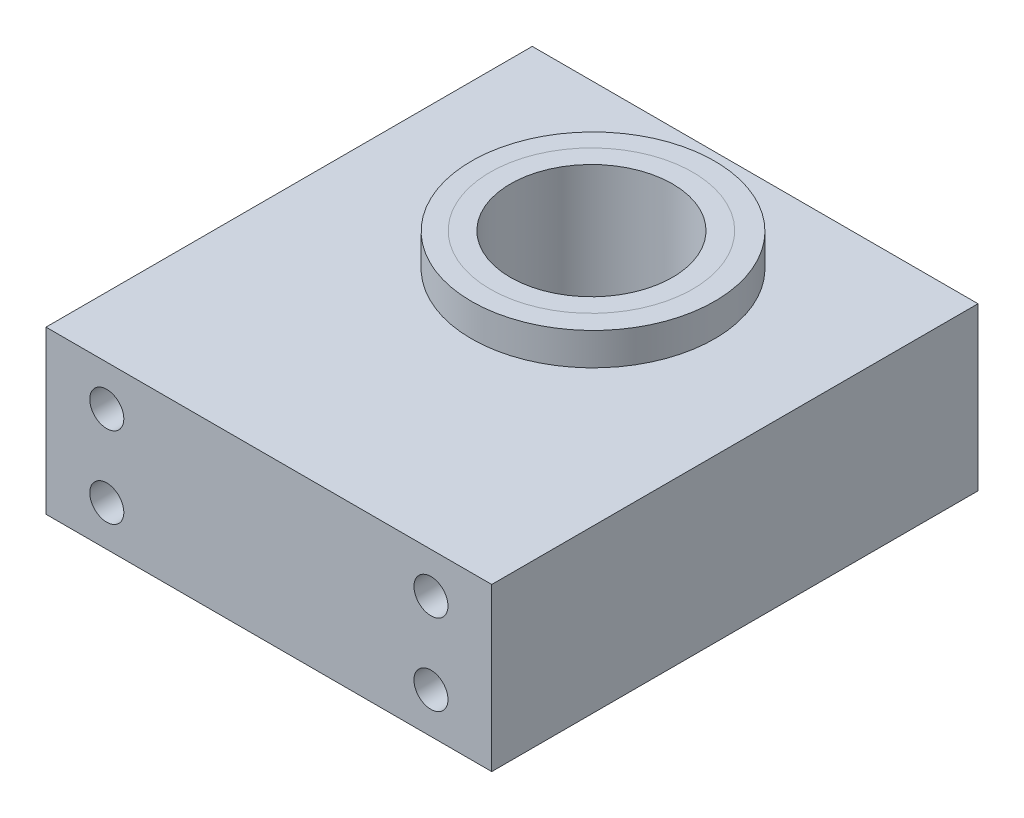
ISO-10303-21;
HEADER;
FILE_DESCRIPTION(('STEP AP214'),'2;1');
FILE_NAME('part.step','',(''),(''),'','','');
FILE_SCHEMA(('AUTOMOTIVE_DESIGN { 1 0 10303 214 1 1 1 1 }'));
ENDSEC;
DATA;
#1=APPLICATION_CONTEXT('core data for automotive mechanical design processes');
#2=APPLICATION_PROTOCOL_DEFINITION('international standard','automotive_design',2000,#1);
#3=PRODUCT_CONTEXT('',#1,'mechanical');
#4=PRODUCT('Part','Part','',(#3));
#5=PRODUCT_RELATED_PRODUCT_CATEGORY('part','',(#4));
#6=PRODUCT_DEFINITION_FORMATION('','',#4);
#7=PRODUCT_DEFINITION_CONTEXT('part definition',#1,'design');
#8=PRODUCT_DEFINITION('design','',#6,#7);
#9=PRODUCT_DEFINITION_SHAPE('','',#8);
#10=(LENGTH_UNIT() NAMED_UNIT(*) SI_UNIT(.MILLI.,.METRE.));
#11=(NAMED_UNIT(*) PLANE_ANGLE_UNIT() SI_UNIT($,.RADIAN.));
#12=(NAMED_UNIT(*) SI_UNIT($,.STERADIAN.) SOLID_ANGLE_UNIT());
#13=UNCERTAINTY_MEASURE_WITH_UNIT(LENGTH_MEASURE(1.E-05),#10,'distance_accuracy_value','');
#14=(GEOMETRIC_REPRESENTATION_CONTEXT(3) GLOBAL_UNCERTAINTY_ASSIGNED_CONTEXT((#13)) GLOBAL_UNIT_ASSIGNED_CONTEXT((#10,
#11,#12)) REPRESENTATION_CONTEXT('',''));
#15=CARTESIAN_POINT('',(0.,0.,0.));
#16=DIRECTION('',(0.,0.,1.));
#17=DIRECTION('',(1.,0.,0.));
#18=AXIS2_PLACEMENT_3D('',#15,#16,#17);
#19=CARTESIAN_POINT('',(-0.316230532057871,118.710678118655,0.0774764803540193));
#20=DIRECTION('',(0.,-1.,0.));
#21=DIRECTION('',(0.,0.,-1.));
#22=AXIS2_PLACEMENT_3D('',#19,#20,#21);
#23=CYLINDRICAL_SURFACE('',#22,25.);
#24=CARTESIAN_POINT('',(-0.316230532057871,22.4799190008132,-24.922523519646));
#25=CARTESIAN_POINT('',(-0.455239837255461,22.4621869101481,-24.9225220265215));
#26=CARTESIAN_POINT('',(-0.592847411947307,22.4327275879034,-24.9213521267131));
#27=CARTESIAN_POINT('',(-0.861256000529966,22.3511603012757,-24.9169434967077));
#28=CARTESIAN_POINT('',(-0.992049250753723,22.2990271098854,-24.9137024602682));
#29=CARTESIAN_POINT('',(-1.24294808501132,22.1736440076452,-24.9056567553287));
#30=CARTESIAN_POINT('',(-1.36306007224317,22.1004068613883,-24.9008530317843));
#31=CARTESIAN_POINT('',(-1.58927576714678,21.9349014404351,-24.8903468224926));
#32=CARTESIAN_POINT('',(-1.695382351723,21.8426370842012,-24.8846445218551));
#33=CARTESIAN_POINT('',(-1.89094367292197,21.6413643228509,-24.8730730731633));
#34=CARTESIAN_POINT('',(-1.98034887253453,21.5323078034375,-24.8672034864657));
#35=CARTESIAN_POINT('',(-2.13960313954408,21.3007109783937,-24.8560693323857));
#36=CARTESIAN_POINT('',(-2.20945150620669,21.1781701898319,-24.8508047866862));
#37=CARTESIAN_POINT('',(-2.32764107148475,20.9229702029001,-24.8415476238178));
#38=CARTESIAN_POINT('',(-2.37596721209624,20.790303996071,-24.8375558977288));
#39=CARTESIAN_POINT('',(-2.4496427703701,20.5186987912336,-24.8313559271911));
#40=CARTESIAN_POINT('',(-2.4749927477621,20.3797599461214,-24.8291476392957));
#41=CARTESIAN_POINT('',(-2.50193308363348,20.1000415548483,-24.8267980654592));
#42=CARTESIAN_POINT('',(-2.50360116407408,19.9592695483122,-24.8266500180168));
#43=CARTESIAN_POINT('',(-2.48332944240001,19.6794506069448,-24.8284220668521));
#44=CARTESIAN_POINT('',(-2.46138989643687,19.5404036534126,-24.8303421406901));
#45=CARTESIAN_POINT('',(-2.39459173371572,19.2681927836016,-24.8360043002316));
#46=CARTESIAN_POINT('',(-2.34976770030956,19.1350203186788,-24.8397436362411));
#47=CARTESIAN_POINT('',(-2.23850404669461,18.8780820051222,-24.8485733786926));
#48=CARTESIAN_POINT('',(-2.1720639619905,18.7543163586968,-24.8536638141671));
#49=CARTESIAN_POINT('',(-2.01923001016168,18.5193206799219,-24.8645694904707));
#50=CARTESIAN_POINT('',(-1.93277993893306,18.4081272951398,-24.870386751222));
#51=CARTESIAN_POINT('',(-1.74246368046499,18.2018012693163,-24.8819891520198));
#52=CARTESIAN_POINT('',(-1.63859721606111,18.106668883918,-24.8877742915536));
#53=CARTESIAN_POINT('',(-1.41609928561113,17.9349438957644,-24.8985660374028));
#54=CARTESIAN_POINT('',(-1.29743396938952,17.8583950225896,-24.9035707976745));
#55=CARTESIAN_POINT('',(-1.04888330458769,17.7263139054799,-24.9120945777881));
#56=CARTESIAN_POINT('',(-0.918998156351235,17.6707812863695,-24.9156136241526));
#57=CARTESIAN_POINT('',(-0.652030553685769,17.5824441337962,-24.9206235484912));
#58=CARTESIAN_POINT('',(-0.514966476302556,17.5495843530348,-24.9221193651154));
#59=CARTESIAN_POINT('',(-0.237264314048751,17.5073246263489,-24.9227842261098));
#60=CARTESIAN_POINT('',(-0.0966263214371065,17.4979240754556,-24.9219533304827));
#61=CARTESIAN_POINT('',(0.183690037520714,17.5028339660169,-24.9179162840383));
#62=CARTESIAN_POINT('',(0.323370035421731,17.5170589811877,-24.9147187138973));
#63=CARTESIAN_POINT('',(0.598325504146665,17.5686275029331,-24.9061684609284));
#64=CARTESIAN_POINT('',(0.733600938617829,17.6059712002653,-24.9008157603182));
#65=CARTESIAN_POINT('',(0.996113826762391,17.7027510565247,-24.8884013633587));
#66=CARTESIAN_POINT('',(1.12334078533805,17.7622153928626,-24.8813374913288));
#67=CARTESIAN_POINT('',(1.36602397029797,17.9015347165639,-24.8661564174172));
#68=CARTESIAN_POINT('',(1.48147979996528,17.9813903908496,-24.8580391800553));
#69=CARTESIAN_POINT('',(1.69795018595348,18.1596945501609,-24.8414909788288));
#70=CARTESIAN_POINT('',(1.79889089195699,18.2582325839211,-24.8330586678516));
#71=CARTESIAN_POINT('',(1.9828180579565,18.4708841381021,-24.8167582544762));
#72=CARTESIAN_POINT('',(2.06580432383769,18.5849978268977,-24.8088901581785));
#73=CARTESIAN_POINT('',(2.211558846929,18.8257620654372,-24.7945092055841));
#74=CARTESIAN_POINT('',(2.27430109878961,18.9524284696059,-24.7879980962349));
#75=CARTESIAN_POINT('',(2.37759908321564,19.2145890709107,-24.7770200436955));
#76=CARTESIAN_POINT('',(2.41815557766344,19.3500829647227,-24.7725530303097));
#77=CARTESIAN_POINT('',(2.47574654485208,19.6253573863998,-24.7661486326702));
#78=CARTESIAN_POINT('',(2.49289331368355,19.7651141381606,-24.7641991742001));
#79=CARTESIAN_POINT('',(2.50351999720943,20.0455342661518,-24.7629952956357));
#80=CARTESIAN_POINT('',(2.49700054520181,20.1861976180215,-24.7637408034254));
#81=CARTESIAN_POINT('',(2.46056774832408,20.4638154228997,-24.7678393394366));
#82=CARTESIAN_POINT('',(2.43075297573594,20.6007829938433,-24.7711813803013));
#83=CARTESIAN_POINT('',(2.34872242805568,20.8677587538046,-24.7801121848854));
#84=CARTESIAN_POINT('',(2.2965062648336,20.9977668221969,-24.7857009875323));
#85=CARTESIAN_POINT('',(2.17101591971219,21.2475050225184,-24.7985677062333));
#86=CARTESIAN_POINT('',(2.09768911795842,21.3672084887758,-24.8058498341959));
#87=CARTESIAN_POINT('',(1.9321086290991,21.5926445680184,-24.8213560855778));
#88=CARTESIAN_POINT('',(1.83985491136926,21.6983771583977,-24.8295802105213));
#89=CARTESIAN_POINT('',(1.63844090263888,21.8934829194169,-24.8461970858139));
#90=CARTESIAN_POINT('',(1.52919073873102,21.9827632704224,-24.8545905132332));
#91=CARTESIAN_POINT('',(1.29718363890187,22.1417497768474,-24.8706776299855));
#92=CARTESIAN_POINT('',(1.17442359155235,22.2114514099546,-24.8783711573777));
#93=CARTESIAN_POINT('',(0.91872310820246,22.3293345287549,-24.8923312339045));
#94=CARTESIAN_POINT('',(0.785770397202457,22.3774895734895,-24.8985960251665));
#95=CARTESIAN_POINT('',(0.513683199240949,22.450700607633,-24.9091141325868));
#96=CARTESIAN_POINT('',(0.374555924681231,22.4757828404106,-24.9133697313418));
#97=CARTESIAN_POINT('',(0.142805749446679,22.4976162562298,-24.9184777305091));
#98=CARTESIAN_POINT('',(0.0507840695224609,22.5011751406335,-24.9199985026679));
#99=CARTESIAN_POINT('',(-0.13310330389952,22.4981471678052,-24.9220218846897));
#100=CARTESIAN_POINT('',(-0.224968998214411,22.4915603638864,-24.9225244999029));
#101=CARTESIAN_POINT('',(-0.316230532057871,22.4799190008132,-24.922523519646));
#102=B_SPLINE_CURVE_WITH_KNOTS('',3,(#24,#25,#26,#27,#28,#29,#30,#31,#32,#33,#34,#35,#36,#37,
#38,#39,#40,#41,#42,#43,#44,#45,#46,#47,#48,#49,#50,#51,#52,#53,#54,#55,#56,#57,#58,#59,#60,#61,
#62,#63,#64,#65,#66,#67,#68,#69,#70,#71,#72,#73,#74,#75,#76,#77,#78,#79,#80,#81,#82,#83,#84,#85,
#86,#87,#88,#89,#90,#91,#92,#93,#94,#95,#96,#97,#98,#99,#100,#101),.UNSPECIFIED.,.T.,.F.,(4,2,2,
2,2,2,2,2,2,2,2,2,2,2,2,2,2,2,2,2,2,2,2,2,2,2,2,2,2,2,2,2,2,2,2,2,2,2,4),(0.,0.420070917164623,
0.840610406775001,1.26089606773649,1.68109526137774,2.10252165336175,2.52396314340272,
2.94569903310682,3.36742464849269,3.78776587530747,4.20810254130925,4.6278058607844,
5.04751819962687,5.46842404891649,5.88933659713644,6.3112302135584,6.73311629811245,
7.15397070014653,7.57481424903537,7.99413940513791,8.41346802123412,8.83333262008234,
9.25321136475923,9.67515603368312,10.097105264243,10.5195943901801,10.9420690064826,
11.3625098124763,11.7829393677367,12.2015994804023,12.6202668471304,13.0399869451836,
13.4597077223613,13.8817284453427,14.303846567096,14.7264812811111,15.1486346874029,
15.4244185107799,15.7002008849813),.UNSPECIFIED.);
#103=CARTESIAN_POINT('',(-0.316230532057871,22.4799190008132,-24.922523519646));
#104=VERTEX_POINT('',#103);
#105=EDGE_CURVE('E70',#104,#104,#102,.T.);
#106=ORIENTED_EDGE('',*,*,#105,.T.);
#107=EDGE_LOOP('',(#106));
#108=FACE_BOUND('',#107,.T.);
#109=CARTESIAN_POINT('',(-0.316230532057871,0.,0.0774764803540193));
#110=DIRECTION('',(0.,1.,0.));
#111=DIRECTION('',(0.,0.,1.));
#112=AXIS2_PLACEMENT_3D('',#109,#110,#111);
#113=CIRCLE('',#112,25.);
#114=CARTESIAN_POINT('',(-0.316230532057871,0.,25.077476480354));
#115=VERTEX_POINT('',#114);
#116=EDGE_CURVE('E56',#115,#115,#113,.T.);
#117=ORIENTED_EDGE('',*,*,#116,.T.);
#118=EDGE_LOOP('',(#117));
#119=FACE_BOUND('',#118,.T.);
#120=CARTESIAN_POINT('',(-0.316230532057871,48.,0.0774764803540193));
#121=DIRECTION('',(0.,1.,0.));
#122=DIRECTION('',(0.,0.,1.));
#123=AXIS2_PLACEMENT_3D('',#120,#121,#122);
#124=CIRCLE('',#123,25.);
#125=CARTESIAN_POINT('',(-0.316230532057871,48.,25.077476480354));
#126=VERTEX_POINT('',#125);
#127=EDGE_CURVE('E11',#126,#126,#124,.T.);
#128=ORIENTED_EDGE('',*,*,#127,.F.);
#129=EDGE_LOOP('',(#128));
#130=FACE_BOUND('',#129,.T.);
#131=ADVANCED_FACE('F51',(#108,#119,#130),#23,.T.);
#132=CARTESIAN_POINT('',(-0.316230532057871,0.,0.0774764803540193));
#133=DIRECTION('',(0.,1.,0.));
#134=DIRECTION('',(0.,0.,1.));
#135=AXIS2_PLACEMENT_3D('',#132,#133,#134);
#136=PLANE('',#135);
#137=ORIENTED_EDGE('',*,*,#116,.F.);
#138=EDGE_LOOP('',(#137));
#139=FACE_BOUND('',#138,.T.);
#140=CARTESIAN_POINT('',(-0.316230532057871,0.,0.0774764803540193));
#141=DIRECTION('',(0.,1.,0.));
#142=DIRECTION('',(0.,0.,1.));
#143=AXIS2_PLACEMENT_3D('',#140,#141,#142);
#144=CIRCLE('',#143,20.);
#145=CARTESIAN_POINT('',(-0.316230532057871,0.,20.077476480354));
#146=VERTEX_POINT('',#145);
#147=EDGE_CURVE('E61',#146,#146,#144,.T.);
#148=ORIENTED_EDGE('',*,*,#147,.T.);
#149=EDGE_LOOP('',(#148));
#150=FACE_BOUND('',#149,.T.);
#151=ADVANCED_FACE('F104',(#139,#150),#136,.F.);
#152=CARTESIAN_POINT('',(-0.316230532057871,118.710678118655,0.0774764803540193));
#153=DIRECTION('',(0.,-1.,0.));
#154=DIRECTION('',(0.,0.,-1.));
#155=AXIS2_PLACEMENT_3D('',#152,#153,#154);
#156=CYLINDRICAL_SURFACE('',#155,20.);
#157=CARTESIAN_POINT('',(-0.316230532057871,22.4799190008132,-19.922523519646));
#158=CARTESIAN_POINT('',(-0.455078556258388,22.4622075985312,-19.9225217134355));
#159=CARTESIAN_POINT('',(-0.592523292747166,22.432796505401,-19.9210627598146));
#160=CARTESIAN_POINT('',(-0.860604643545794,22.351387778882,-19.9155647185992));
#161=CARTESIAN_POINT('',(-0.991233851442126,22.2993661245985,-19.9115228848638));
#162=CARTESIAN_POINT('',(-1.24181145623698,22.1742798909192,-19.9014879513955));
#163=CARTESIAN_POINT('',(-1.36176698481768,22.1012295023246,-19.895496167191));
#164=CARTESIAN_POINT('',(-1.58771749148603,21.936163384584,-19.8823870160484));
#165=CARTESIAN_POINT('',(-1.69371500636284,21.8441511094712,-19.8752698541601));
#166=CARTESIAN_POINT('',(-1.88928564562329,21.6432701023566,-19.8608077123843));
#167=CARTESIAN_POINT('',(-1.9787828692798,21.5343275229642,-19.8534618529042));
#168=CARTESIAN_POINT('',(-2.13824975063086,21.3029321420336,-19.8395181453194));
#169=CARTESIAN_POINT('',(-2.20821873694656,21.1804788762013,-19.8329203229369));
#170=CARTESIAN_POINT('',(-2.32669788182071,20.9253538055188,-19.8213070732913));
#171=CARTESIAN_POINT('',(-2.37518366020605,20.7926705906017,-19.8162934456892));
#172=CARTESIAN_POINT('',(-2.44916307243044,20.52098027756,-19.8084983712165));
#173=CARTESIAN_POINT('',(-2.47465756583604,20.3819734160593,-19.8057168408958));
#174=CARTESIAN_POINT('',(-2.50183077348873,20.1023449975132,-19.8027483990198));
#175=CARTESIAN_POINT('',(-2.50363097703418,19.9617353801862,-19.8025482518743));
#176=CARTESIAN_POINT('',(-2.48367616633291,19.6822204403466,-19.8047335795618));
#177=CARTESIAN_POINT('',(-2.4619215253993,19.5433150908588,-19.8071190134167));
#178=CARTESIAN_POINT('',(-2.39557803505077,19.271485294857,-19.8141652758931));
#179=CARTESIAN_POINT('',(-2.35104371454119,19.1385473866344,-19.8188206695553));
#180=CARTESIAN_POINT('',(-2.24045417664613,18.882021605394,-19.8298195168966));
#181=CARTESIAN_POINT('',(-2.17439825729615,18.7584340375158,-19.8361630256353));
#182=CARTESIAN_POINT('',(-2.0222928341067,18.5235180845133,-19.8497708541771));
#183=CARTESIAN_POINT('',(-1.93615588802148,18.4122465478864,-19.8570391361222));
#184=CARTESIAN_POINT('',(-1.74646298985237,18.2056951734365,-19.8715450748241));
#185=CARTESIAN_POINT('',(-1.64290659551476,18.1104157417519,-19.8787827307986));
#186=CARTESIAN_POINT('',(-1.42084760103042,17.9382034262632,-19.8923061070562));
#187=CARTESIAN_POINT('',(-1.30229150146306,17.8613392135004,-19.8985882333022));
#188=CARTESIAN_POINT('',(-1.05387496092007,17.7286177479769,-19.909302044525));
#189=CARTESIAN_POINT('',(-0.924014834903084,17.6727599101562,-19.9137337810384));
#190=CARTESIAN_POINT('',(-0.657195142680414,17.5838472858502,-19.920060123575));
#191=CARTESIAN_POINT('',(-0.520264272023127,17.5507070903983,-19.9219642579213));
#192=CARTESIAN_POINT('',(-0.242777200860137,17.5078591388442,-19.9228696402836));
#193=CARTESIAN_POINT('',(-0.102221146283204,17.4981504410098,-19.9218710049681));
#194=CARTESIAN_POINT('',(0.17768051627949,17.5024189419395,-19.9169111592939));
#195=CARTESIAN_POINT('',(0.317028480889905,17.5162629074906,-19.9129666837702));
#196=CARTESIAN_POINT('',(0.591369540016243,17.5669481977484,-19.9023912535041));
#197=CARTESIAN_POINT('',(0.726362581669757,17.6037898015025,-19.8957602661645));
#198=CARTESIAN_POINT('',(0.988472132090592,17.6994728224384,-19.8803549112645));
#199=CARTESIAN_POINT('',(1.11557303489295,17.75835630539,-19.8715764565461));
#200=CARTESIAN_POINT('',(1.35811214589398,17.8964300489308,-19.8526864164718));
#201=CARTESIAN_POINT('',(1.4735497466656,17.975621366397,-19.8425747617458));
#202=CARTESIAN_POINT('',(1.69043129495673,18.1527865711139,-19.8219025641485));
#203=CARTESIAN_POINT('',(1.79176118231775,18.2508997925861,-19.8113391743225));
#204=CARTESIAN_POINT('',(1.9765455241788,18.4627854681069,-19.7908863745506));
#205=CARTESIAN_POINT('',(2.05999965244475,18.5765582078808,-19.7809969769073));
#206=CARTESIAN_POINT('',(2.20682064055308,18.8168645975726,-19.7628792932454));
#207=CARTESIAN_POINT('',(2.27014410930621,18.9434250481012,-19.7546546091405));
#208=CARTESIAN_POINT('',(2.37459686628348,19.2055262572501,-19.7407535717697));
#209=CARTESIAN_POINT('',(2.41572734396545,19.3410665341494,-19.7350770819332));
#210=CARTESIAN_POINT('',(2.47433544551813,19.6162029059121,-19.7269073729893));
#211=CARTESIAN_POINT('',(2.49198722534335,19.7557612027536,-19.7243907233086));
#212=CARTESIAN_POINT('',(2.50366954860989,20.0358799793225,-19.7227306258777));
#213=CARTESIAN_POINT('',(2.49770111670036,20.1764404153127,-19.7235870318036));
#214=CARTESIAN_POINT('',(2.46244718545243,20.4535831359789,-19.7285644283424));
#215=CARTESIAN_POINT('',(2.43331804636697,20.5901857526868,-19.7326635262794));
#216=CARTESIAN_POINT('',(2.35280448208324,20.8565454396002,-19.7436710504762));
#217=CARTESIAN_POINT('',(2.30141949777734,20.9863023377367,-19.750579547313));
#218=CARTESIAN_POINT('',(2.17764675722397,21.2358510706472,-19.7665267828571));
#219=CARTESIAN_POINT('',(2.10517973757499,21.3556030609445,-19.7755735363676));
#220=CARTESIAN_POINT('',(1.94137209620667,21.5813031780433,-19.7948663684698));
#221=CARTESIAN_POINT('',(1.85003101775996,21.6872509707002,-19.8051124760817));
#222=CARTESIAN_POINT('',(1.65013178375506,21.8833038626393,-19.8258795734394));
#223=CARTESIAN_POINT('',(1.54143117594041,21.9732635895338,-19.8364021765119));
#224=CARTESIAN_POINT('',(1.3103835783804,22.1337003263918,-19.8566036814098));
#225=CARTESIAN_POINT('',(1.18803355907076,22.2041729989706,-19.8662823950766));
#226=CARTESIAN_POINT('',(0.932901706066219,22.3236999773374,-19.8838872311747));
#227=CARTESIAN_POINT('',(0.800101412620011,22.3727153305735,-19.8918101534659));
#228=CARTESIAN_POINT('',(0.528119278638471,22.4476404515895,-19.9051545768962));
#229=CARTESIAN_POINT('',(0.388944636080148,22.4735756368061,-19.9105788265574));
#230=CARTESIAN_POINT('',(0.15474232058212,22.4969938678716,-19.9171992611461));
#231=CARTESIAN_POINT('',(0.0603441968178285,22.5010516948984,-19.9192005706026));
#232=CARTESIAN_POINT('',(-0.128325514391307,22.4984861377883,-19.9218633030663));
#233=CARTESIAN_POINT('',(-0.222597102925214,22.4918628461791,-19.9225247376805));
#234=CARTESIAN_POINT('',(-0.316230532057871,22.4799190008132,-19.922523519646));
#235=B_SPLINE_CURVE_WITH_KNOTS('',3,(#157,#158,#159,#160,#161,#162,#163,#164,#165,#166,#167,
#168,#169,#170,#171,#172,#173,#174,#175,#176,#177,#178,#179,#180,#181,#182,#183,#184,#185,#186,
#187,#188,#189,#190,#191,#192,#193,#194,#195,#196,#197,#198,#199,#200,#201,#202,#203,#204,#205,
#206,#207,#208,#209,#210,#211,#212,#213,#214,#215,#216,#217,#218,#219,#220,#221,#222,#223,#224,
#225,#226,#227,#228,#229,#230,#231,#232,#233,#234),.UNSPECIFIED.,.T.,.F.,(4,2,2,2,2,2,2,2,2,2,2,
2,2,2,2,2,2,2,2,2,2,2,2,2,2,2,2,2,2,2,2,2,2,2,2,2,2,2,4),(0.,0.419574131560223,
0.839595101897549,1.25933329168145,1.67899509085263,2.10054161330968,2.5221026267094,
2.94414083001799,3.36616325408822,3.7860209667312,4.20587202528291,4.62472273528393,
5.04358710819947,5.46431065469024,5.8850448843347,6.30732444347798,6.72959224061298,
7.1502636475254,7.57091814700749,7.98920098323934,8.40748889490537,8.82657919105262,
9.24569130226604,9.66801634891134,10.0903491023669,10.5135861054425,10.9368004224103,
11.3568576589966,11.776896673622,12.1941237969928,12.6113614024815,13.0301884555111,
13.4490256447912,13.8714953904586,14.2940590929457,14.7173867473105,15.1402476257418,
15.4231937120603,15.7061373473014),.UNSPECIFIED.);
#236=CARTESIAN_POINT('',(-0.316230532057871,22.4799190008132,-19.922523519646));
#237=VERTEX_POINT('',#236);
#238=EDGE_CURVE('E79',#237,#237,#235,.T.);
#239=ORIENTED_EDGE('',*,*,#238,.F.);
#240=EDGE_LOOP('',(#239));
#241=FACE_BOUND('',#240,.T.);
#242=ORIENTED_EDGE('',*,*,#147,.F.);
#243=EDGE_LOOP('',(#242));
#244=FACE_BOUND('',#243,.T.);
#245=CARTESIAN_POINT('',(-0.316230532057871,48.,0.0774764803540193));
#246=DIRECTION('',(0.,1.,0.));
#247=DIRECTION('',(0.,0.,1.));
#248=AXIS2_PLACEMENT_3D('',#245,#246,#247);
#249=CIRCLE('',#248,20.);
#250=CARTESIAN_POINT('',(-0.316230532057871,48.,20.077476480354));
#251=VERTEX_POINT('',#250);
#252=EDGE_CURVE('E54',#251,#251,#249,.T.);
#253=ORIENTED_EDGE('',*,*,#252,.T.);
#254=EDGE_LOOP('',(#253));
#255=FACE_BOUND('',#254,.T.);
#256=ADVANCED_FACE('F101',(#241,#244,#255),#156,.F.);
#257=CARTESIAN_POINT('',(0.,48.,0.));
#258=DIRECTION('',(0.,1.,0.));
#259=DIRECTION('',(0.,0.,1.));
#260=AXIS2_PLACEMENT_3D('',#257,#258,#259);
#261=PLANE('',#260);
#262=ORIENTED_EDGE('',*,*,#252,.F.);
#263=EDGE_LOOP('',(#262));
#264=FACE_BOUND('',#263,.T.);
#265=ORIENTED_EDGE('',*,*,#127,.T.);
#266=EDGE_LOOP('',(#265));
#267=FACE_BOUND('',#266,.T.);
#268=ADVANCED_FACE('F94',(#264,#267),#261,.T.);
#269=CARTESIAN_POINT('',(0.,20.,-40.));
#270=DIRECTION('',(0.,0.,-1.));
#271=DIRECTION('',(-1.,0.,0.));
#272=AXIS2_PLACEMENT_3D('',#269,#270,#271);
#273=CYLINDRICAL_SURFACE('',#272,2.49999999999999);
#274=ORIENTED_EDGE('',*,*,#238,.T.);
#275=EDGE_LOOP('',(#274));
#276=FACE_BOUND('',#275,.T.);
#277=ORIENTED_EDGE('',*,*,#105,.F.);
#278=EDGE_LOOP('',(#277));
#279=FACE_BOUND('',#278,.T.);
#280=ADVANCED_FACE('F95',(#276,#279),#273,.F.);
#281=CLOSED_SHELL('',(#131,#151,#256,#268,#280));
#282=MANIFOLD_SOLID_BREP('B2',#281);
#283=CARTESIAN_POINT('',(-55.,40.,-40.));
#284=DIRECTION('',(1.,0.,0.));
#285=DIRECTION('',(0.,0.,-1.));
#286=AXIS2_PLACEMENT_3D('',#283,#284,#285);
#287=PLANE('',#286);
#288=DIRECTION('',(0.,0.,1.));
#289=VECTOR('',#288,1.);
#290=CARTESIAN_POINT('',(-55.,0.,-40.));
#291=LINE('',#290,#289);
#292=CARTESIAN_POINT('',(-55.,0.,-40.));
#293=VERTEX_POINT('',#292);
#294=CARTESIAN_POINT('',(-55.,0.,80.));
#295=VERTEX_POINT('',#294);
#296=EDGE_CURVE('E218',#293,#295,#291,.T.);
#297=ORIENTED_EDGE('',*,*,#296,.T.);
#298=DIRECTION('',(0.,-1.,0.));
#299=VECTOR('',#298,1.);
#300=CARTESIAN_POINT('',(-55.,40.,80.));
#301=LINE('',#300,#299);
#302=CARTESIAN_POINT('',(-55.,40.,80.));
#303=VERTEX_POINT('',#302);
#304=EDGE_CURVE('E159',#303,#295,#301,.T.);
#305=ORIENTED_EDGE('',*,*,#304,.F.);
#306=DIRECTION('',(0.,0.,1.));
#307=VECTOR('',#306,1.);
#308=CARTESIAN_POINT('',(-55.,40.,-40.));
#309=LINE('',#308,#307);
#310=CARTESIAN_POINT('',(-55.,40.,-40.));
#311=VERTEX_POINT('',#310);
#312=EDGE_CURVE('E203',#311,#303,#309,.T.);
#313=ORIENTED_EDGE('',*,*,#312,.F.);
#314=DIRECTION('',(0.,-1.,0.));
#315=VECTOR('',#314,1.);
#316=CARTESIAN_POINT('',(-55.,40.,-40.));
#317=LINE('',#316,#315);
#318=EDGE_CURVE('E211',#311,#293,#317,.T.);
#319=ORIENTED_EDGE('',*,*,#318,.T.);
#320=EDGE_LOOP('',(#297,#305,#313,#319));
#321=FACE_BOUND('',#320,.T.);
#322=ADVANCED_FACE('F144',(#321),#287,.F.);
#323=CARTESIAN_POINT('',(-55.,40.,80.));
#324=DIRECTION('',(0.,0.,-1.));
#325=DIRECTION('',(-1.,0.,0.));
#326=AXIS2_PLACEMENT_3D('',#323,#324,#325);
#327=PLANE('',#326);
#328=CARTESIAN_POINT('',(40.,9.99999999999999,80.));
#329=DIRECTION('',(0.,0.,-1.));
#330=DIRECTION('',(-1.,0.,0.));
#331=AXIS2_PLACEMENT_3D('',#328,#329,#330);
#332=CIRCLE('',#331,4.19999999999996);
#333=CARTESIAN_POINT('',(35.8,9.99999999999999,80.));
#334=VERTEX_POINT('',#333);
#335=EDGE_CURVE('E387',#334,#334,#332,.T.);
#336=ORIENTED_EDGE('',*,*,#335,.T.);
#337=EDGE_LOOP('',(#336));
#338=FACE_BOUND('',#337,.T.);
#339=CARTESIAN_POINT('',(-40.,30.,80.));
#340=DIRECTION('',(0.,0.,-1.));
#341=DIRECTION('',(-1.,0.,0.));
#342=AXIS2_PLACEMENT_3D('',#339,#340,#341);
#343=CIRCLE('',#342,4.19999999999996);
#344=CARTESIAN_POINT('',(-44.2,30.,80.));
#345=VERTEX_POINT('',#344);
#346=EDGE_CURVE('E394',#345,#345,#343,.T.);
#347=ORIENTED_EDGE('',*,*,#346,.T.);
#348=EDGE_LOOP('',(#347));
#349=FACE_BOUND('',#348,.T.);
#350=CARTESIAN_POINT('',(40.,30.,80.));
#351=DIRECTION('',(0.,0.,-1.));
#352=DIRECTION('',(-1.,0.,0.));
#353=AXIS2_PLACEMENT_3D('',#350,#351,#352);
#354=CIRCLE('',#353,4.19999999999996);
#355=CARTESIAN_POINT('',(35.8,30.,80.));
#356=VERTEX_POINT('',#355);
#357=EDGE_CURVE('E404',#356,#356,#354,.T.);
#358=ORIENTED_EDGE('',*,*,#357,.T.);
#359=EDGE_LOOP('',(#358));
#360=FACE_BOUND('',#359,.T.);
#361=CARTESIAN_POINT('',(-40.,9.99999999999999,80.));
#362=DIRECTION('',(0.,0.,-1.));
#363=DIRECTION('',(-1.,0.,0.));
#364=AXIS2_PLACEMENT_3D('',#361,#362,#363);
#365=CIRCLE('',#364,4.19999999999996);
#366=CARTESIAN_POINT('',(-44.2,9.99999999999999,80.));
#367=VERTEX_POINT('',#366);
#368=EDGE_CURVE('E283',#367,#367,#365,.T.);
#369=ORIENTED_EDGE('',*,*,#368,.T.);
#370=EDGE_LOOP('',(#369));
#371=FACE_BOUND('',#370,.T.);
#372=DIRECTION('',(1.,0.,0.));
#373=VECTOR('',#372,1.);
#374=CARTESIAN_POINT('',(-55.,0.,80.));
#375=LINE('',#374,#373);
#376=CARTESIAN_POINT('',(55.,0.,80.));
#377=VERTEX_POINT('',#376);
#378=EDGE_CURVE('E206',#295,#377,#375,.T.);
#379=ORIENTED_EDGE('',*,*,#378,.T.);
#380=DIRECTION('',(0.,-1.,0.));
#381=VECTOR('',#380,1.);
#382=CARTESIAN_POINT('',(55.,40.,80.));
#383=LINE('',#382,#381);
#384=CARTESIAN_POINT('',(55.,40.,80.));
#385=VERTEX_POINT('',#384);
#386=EDGE_CURVE('E210',#385,#377,#383,.T.);
#387=ORIENTED_EDGE('',*,*,#386,.F.);
#388=DIRECTION('',(1.,0.,0.));
#389=VECTOR('',#388,1.);
#390=CARTESIAN_POINT('',(-55.,40.,80.));
#391=LINE('',#390,#389);
#392=EDGE_CURVE('E197',#303,#385,#391,.T.);
#393=ORIENTED_EDGE('',*,*,#392,.F.);
#394=ORIENTED_EDGE('',*,*,#304,.T.);
#395=EDGE_LOOP('',(#379,#387,#393,#394));
#396=FACE_BOUND('',#395,.T.);
#397=ADVANCED_FACE('F209',(#338,#349,#360,#371,#396),#327,.F.);
#398=CARTESIAN_POINT('',(55.,40.,-40.));
#399=DIRECTION('',(-1.,0.,0.));
#400=DIRECTION('',(0.,0.,1.));
#401=AXIS2_PLACEMENT_3D('',#398,#399,#400);
#402=PLANE('',#401);
#403=DIRECTION('',(0.,0.,-1.));
#404=VECTOR('',#403,1.);
#405=CARTESIAN_POINT('',(55.,0.,-40.));
#406=LINE('',#405,#404);
#407=CARTESIAN_POINT('',(55.,0.,-40.));
#408=VERTEX_POINT('',#407);
#409=EDGE_CURVE('E184',#377,#408,#406,.T.);
#410=ORIENTED_EDGE('',*,*,#409,.T.);
#411=DIRECTION('',(0.,-1.,0.));
#412=VECTOR('',#411,1.);
#413=CARTESIAN_POINT('',(55.,40.,-40.));
#414=LINE('',#413,#412);
#415=CARTESIAN_POINT('',(55.,40.,-40.));
#416=VERTEX_POINT('',#415);
#417=EDGE_CURVE('E208',#416,#408,#414,.T.);
#418=ORIENTED_EDGE('',*,*,#417,.F.);
#419=DIRECTION('',(0.,0.,-1.));
#420=VECTOR('',#419,1.);
#421=CARTESIAN_POINT('',(55.,40.,-40.));
#422=LINE('',#421,#420);
#423=EDGE_CURVE('E205',#385,#416,#422,.T.);
#424=ORIENTED_EDGE('',*,*,#423,.F.);
#425=ORIENTED_EDGE('',*,*,#386,.T.);
#426=EDGE_LOOP('',(#410,#418,#424,#425));
#427=FACE_BOUND('',#426,.T.);
#428=ADVANCED_FACE('F215',(#427),#402,.F.);
#429=CARTESIAN_POINT('',(-55.,40.,-40.));
#430=DIRECTION('',(0.,0.,1.));
#431=DIRECTION('',(1.,0.,0.));
#432=AXIS2_PLACEMENT_3D('',#429,#430,#431);
#433=PLANE('',#432);
#434=CARTESIAN_POINT('',(40.,9.99999999999999,-40.));
#435=DIRECTION('',(0.,0.,-1.));
#436=DIRECTION('',(-1.,0.,0.));
#437=AXIS2_PLACEMENT_3D('',#434,#435,#436);
#438=CIRCLE('',#437,7.5);
#439=CARTESIAN_POINT('',(32.5,9.99999999999999,-40.));
#440=VERTEX_POINT('',#439);
#441=EDGE_CURVE('E270',#440,#440,#438,.T.);
#442=ORIENTED_EDGE('',*,*,#441,.F.);
#443=EDGE_LOOP('',(#442));
#444=FACE_BOUND('',#443,.T.);
#445=CARTESIAN_POINT('',(-40.,30.,-40.));
#446=DIRECTION('',(0.,0.,-1.));
#447=DIRECTION('',(-1.,0.,0.));
#448=AXIS2_PLACEMENT_3D('',#445,#446,#447);
#449=CIRCLE('',#448,7.5);
#450=CARTESIAN_POINT('',(-47.5,30.,-40.));
#451=VERTEX_POINT('',#450);
#452=EDGE_CURVE('E271',#451,#451,#449,.T.);
#453=ORIENTED_EDGE('',*,*,#452,.F.);
#454=EDGE_LOOP('',(#453));
#455=FACE_BOUND('',#454,.T.);
#456=CARTESIAN_POINT('',(40.,30.,-40.));
#457=DIRECTION('',(0.,0.,-1.));
#458=DIRECTION('',(-1.,0.,0.));
#459=AXIS2_PLACEMENT_3D('',#456,#457,#458);
#460=CIRCLE('',#459,7.5);
#461=CARTESIAN_POINT('',(32.5,30.,-40.));
#462=VERTEX_POINT('',#461);
#463=EDGE_CURVE('E274',#462,#462,#460,.T.);
#464=ORIENTED_EDGE('',*,*,#463,.F.);
#465=EDGE_LOOP('',(#464));
#466=FACE_BOUND('',#465,.T.);
#467=CARTESIAN_POINT('',(-40.,9.99999999999999,-40.));
#468=DIRECTION('',(0.,0.,-1.));
#469=DIRECTION('',(-1.,0.,0.));
#470=AXIS2_PLACEMENT_3D('',#467,#468,#469);
#471=CIRCLE('',#470,7.5);
#472=CARTESIAN_POINT('',(-47.5,9.99999999999999,-40.));
#473=VERTEX_POINT('',#472);
#474=EDGE_CURVE('E278',#473,#473,#471,.T.);
#475=ORIENTED_EDGE('',*,*,#474,.F.);
#476=EDGE_LOOP('',(#475));
#477=FACE_BOUND('',#476,.T.);
#478=CARTESIAN_POINT('',(0.,20.,-40.));
#479=DIRECTION('',(0.,0.,-1.));
#480=DIRECTION('',(-1.,0.,0.));
#481=AXIS2_PLACEMENT_3D('',#478,#479,#480);
#482=CIRCLE('',#481,3.);
#483=CARTESIAN_POINT('',(-3.,20.,-40.));
#484=VERTEX_POINT('',#483);
#485=EDGE_CURVE('E285',#484,#484,#482,.T.);
#486=ORIENTED_EDGE('',*,*,#485,.F.);
#487=EDGE_LOOP('',(#486));
#488=FACE_BOUND('',#487,.T.);
#489=DIRECTION('',(-1.,0.,0.));
#490=VECTOR('',#489,1.);
#491=CARTESIAN_POINT('',(-55.,0.,-40.));
#492=LINE('',#491,#490);
#493=EDGE_CURVE('E191',#408,#293,#492,.T.);
#494=ORIENTED_EDGE('',*,*,#493,.T.);
#495=ORIENTED_EDGE('',*,*,#318,.F.);
#496=DIRECTION('',(-1.,0.,0.));
#497=VECTOR('',#496,1.);
#498=CARTESIAN_POINT('',(-55.,40.,-40.));
#499=LINE('',#498,#497);
#500=EDGE_CURVE('E168',#416,#311,#499,.T.);
#501=ORIENTED_EDGE('',*,*,#500,.F.);
#502=ORIENTED_EDGE('',*,*,#417,.T.);
#503=EDGE_LOOP('',(#494,#495,#501,#502));
#504=FACE_BOUND('',#503,.T.);
#505=ADVANCED_FACE('F243',(#444,#455,#466,#477,#488,#504),#433,.F.);
#506=CARTESIAN_POINT('',(0.,40.,0.));
#507=DIRECTION('',(0.,1.,0.));
#508=DIRECTION('',(0.,0.,1.));
#509=AXIS2_PLACEMENT_3D('',#506,#507,#508);
#510=PLANE('',#509);
#511=CARTESIAN_POINT('',(0.,40.,0.));
#512=DIRECTION('',(0.,1.,0.));
#513=DIRECTION('',(0.,0.,1.));
#514=AXIS2_PLACEMENT_3D('',#511,#512,#513);
#515=CIRCLE('',#514,30.);
#516=CARTESIAN_POINT('',(0.,40.,30.));
#517=VERTEX_POINT('',#516);
#518=EDGE_CURVE('E47',#517,#517,#515,.T.);
#519=ORIENTED_EDGE('',*,*,#518,.F.);
#520=EDGE_LOOP('',(#519));
#521=FACE_BOUND('',#520,.T.);
#522=ORIENTED_EDGE('',*,*,#312,.T.);
#523=ORIENTED_EDGE('',*,*,#392,.T.);
#524=ORIENTED_EDGE('',*,*,#423,.T.);
#525=ORIENTED_EDGE('',*,*,#500,.T.);
#526=EDGE_LOOP('',(#522,#523,#524,#525));
#527=FACE_BOUND('',#526,.T.);
#528=ADVANCED_FACE('F199',(#521,#527),#510,.T.);
#529=CARTESIAN_POINT('',(0.,0.,0.));
#530=DIRECTION('',(0.,1.,0.));
#531=DIRECTION('',(0.,0.,1.));
#532=AXIS2_PLACEMENT_3D('',#529,#530,#531);
#533=PLANE('',#532);
#534=CARTESIAN_POINT('',(-0.316230532057871,0.,0.0774764803540193));
#535=DIRECTION('',(0.,1.,0.));
#536=DIRECTION('',(0.,0.,1.));
#537=AXIS2_PLACEMENT_3D('',#534,#535,#536);
#538=CIRCLE('',#537,25.);
#539=CARTESIAN_POINT('',(-0.316230532057871,0.,25.077476480354));
#540=VERTEX_POINT('',#539);
#541=EDGE_CURVE('E296',#540,#540,#538,.T.);
#542=ORIENTED_EDGE('',*,*,#541,.T.);
#543=EDGE_LOOP('',(#542));
#544=FACE_BOUND('',#543,.T.);
#545=ORIENTED_EDGE('',*,*,#296,.F.);
#546=ORIENTED_EDGE('',*,*,#493,.F.);
#547=ORIENTED_EDGE('',*,*,#409,.F.);
#548=ORIENTED_EDGE('',*,*,#378,.F.);
#549=EDGE_LOOP('',(#545,#546,#547,#548));
#550=FACE_BOUND('',#549,.T.);
#551=ADVANCED_FACE('F227',(#544,#550),#533,.F.);
#552=CARTESIAN_POINT('',(0.,48.,0.));
#553=DIRECTION('',(0.,1.,0.));
#554=DIRECTION('',(0.,0.,1.));
#555=AXIS2_PLACEMENT_3D('',#552,#553,#554);
#556=PLANE('',#555);
#557=CARTESIAN_POINT('',(0.,48.,0.));
#558=DIRECTION('',(0.,1.,0.));
#559=DIRECTION('',(0.,0.,1.));
#560=AXIS2_PLACEMENT_3D('',#557,#558,#559);
#561=CIRCLE('',#560,30.);
#562=CARTESIAN_POINT('',(0.,48.,30.));
#563=VERTEX_POINT('',#562);
#564=EDGE_CURVE('E224',#563,#563,#561,.T.);
#565=ORIENTED_EDGE('',*,*,#564,.T.);
#566=EDGE_LOOP('',(#565));
#567=FACE_BOUND('',#566,.T.);
#568=CARTESIAN_POINT('',(-0.316230532057871,48.,0.0774764803540193));
#569=DIRECTION('',(0.,1.,0.));
#570=DIRECTION('',(0.,0.,1.));
#571=AXIS2_PLACEMENT_3D('',#568,#569,#570);
#572=CIRCLE('',#571,25.);
#573=CARTESIAN_POINT('',(-0.316230532057871,48.,25.077476480354));
#574=VERTEX_POINT('',#573);
#575=EDGE_CURVE('E298',#574,#574,#572,.T.);
#576=ORIENTED_EDGE('',*,*,#575,.F.);
#577=EDGE_LOOP('',(#576));
#578=FACE_BOUND('',#577,.T.);
#579=ADVANCED_FACE('F232',(#567,#578),#556,.T.);
#580=CARTESIAN_POINT('',(0.,48.,0.));
#581=DIRECTION('',(0.,-1.,0.));
#582=DIRECTION('',(0.,0.,-1.));
#583=AXIS2_PLACEMENT_3D('',#580,#581,#582);
#584=CYLINDRICAL_SURFACE('',#583,30.);
#585=ORIENTED_EDGE('',*,*,#564,.F.);
#586=EDGE_LOOP('',(#585));
#587=FACE_BOUND('',#586,.T.);
#588=ORIENTED_EDGE('',*,*,#518,.T.);
#589=EDGE_LOOP('',(#588));
#590=FACE_BOUND('',#589,.T.);
#591=ADVANCED_FACE('F236',(#587,#590),#584,.T.);
#592=CARTESIAN_POINT('',(-0.316230532057871,48.,0.0774764803540193));
#593=DIRECTION('',(0.,-1.,0.));
#594=DIRECTION('',(0.,0.,-1.));
#595=AXIS2_PLACEMENT_3D('',#592,#593,#594);
#596=CYLINDRICAL_SURFACE('',#595,25.);
#597=CARTESIAN_POINT('',(-0.316230532057871,22.4799190008132,-24.922523519646));
#598=CARTESIAN_POINT('',(-0.455239837255461,22.4621869101481,-24.9225220265215));
#599=CARTESIAN_POINT('',(-0.592847411947308,22.4327275879034,-24.9213521267131));
#600=CARTESIAN_POINT('',(-0.861256000529967,22.3511603012757,-24.9169434967077));
#601=CARTESIAN_POINT('',(-0.992049250753723,22.2990271098854,-24.9137024602682));
#602=CARTESIAN_POINT('',(-1.24294808501132,22.1736440076452,-24.9056567553287));
#603=CARTESIAN_POINT('',(-1.36306007224317,22.1004068613883,-24.9008530317843));
#604=CARTESIAN_POINT('',(-1.58927576714679,21.9349014404351,-24.8903468224926));
#605=CARTESIAN_POINT('',(-1.695382351723,21.8426370842012,-24.8846445218551));
#606=CARTESIAN_POINT('',(-1.89094367292197,21.6413643228509,-24.8730730731633));
#607=CARTESIAN_POINT('',(-1.98034887253453,21.5323078034375,-24.8672034864657));
#608=CARTESIAN_POINT('',(-2.13960313954408,21.3007109783937,-24.8560693323857));
#609=CARTESIAN_POINT('',(-2.20945150620669,21.1781701898319,-24.8508047866862));
#610=CARTESIAN_POINT('',(-2.32764107148475,20.9229702029001,-24.8415476238178));
#611=CARTESIAN_POINT('',(-2.37596721209624,20.790303996071,-24.8375558977288));
#612=CARTESIAN_POINT('',(-2.44964277037011,20.5186987912336,-24.8313559271911));
#613=CARTESIAN_POINT('',(-2.4749927477621,20.3797599461214,-24.8291476392957));
#614=CARTESIAN_POINT('',(-2.50193308363348,20.1000415548482,-24.8267980654592));
#615=CARTESIAN_POINT('',(-2.50360116407408,19.9592695483122,-24.8266500180168));
#616=CARTESIAN_POINT('',(-2.48332944240001,19.6794506069448,-24.8284220668521));
#617=CARTESIAN_POINT('',(-2.46138989643687,19.5404036534126,-24.8303421406901));
#618=CARTESIAN_POINT('',(-2.39459173371572,19.2681927836016,-24.8360043002316));
#619=CARTESIAN_POINT('',(-2.34976770030956,19.1350203186788,-24.8397436362411));
#620=CARTESIAN_POINT('',(-2.23850404669461,18.8780820051222,-24.8485733786926));
#621=CARTESIAN_POINT('',(-2.1720639619905,18.7543163586968,-24.8536638141671));
#622=CARTESIAN_POINT('',(-2.01923001016168,18.5193206799219,-24.8645694904707));
#623=CARTESIAN_POINT('',(-1.93277993893305,18.4081272951398,-24.870386751222));
#624=CARTESIAN_POINT('',(-1.74246368046499,18.2018012693163,-24.8819891520198));
#625=CARTESIAN_POINT('',(-1.63859721606111,18.106668883918,-24.8877742915536));
#626=CARTESIAN_POINT('',(-1.41609928561113,17.9349438957644,-24.8985660374028));
#627=CARTESIAN_POINT('',(-1.29743396938952,17.8583950225896,-24.9035707976745));
#628=CARTESIAN_POINT('',(-1.04888330458769,17.7263139054799,-24.9120945777881));
#629=CARTESIAN_POINT('',(-0.918998156351233,17.6707812863695,-24.9156136241526));
#630=CARTESIAN_POINT('',(-0.652030553685768,17.5824441337962,-24.9206235484912));
#631=CARTESIAN_POINT('',(-0.514966476302555,17.5495843530348,-24.9221193651154));
#632=CARTESIAN_POINT('',(-0.23726431404875,17.5073246263489,-24.9227842261098));
#633=CARTESIAN_POINT('',(-0.096626321437106,17.4979240754556,-24.9219533304827));
#634=CARTESIAN_POINT('',(0.183690037520713,17.5028339660169,-24.9179162840383));
#635=CARTESIAN_POINT('',(0.32337003542173,17.5170589811877,-24.9147187138973));
#636=CARTESIAN_POINT('',(0.598325504146664,17.5686275029331,-24.9061684609284));
#637=CARTESIAN_POINT('',(0.733600938617828,17.6059712002653,-24.9008157603182));
#638=CARTESIAN_POINT('',(0.996113826762391,17.7027510565247,-24.8884013633587));
#639=CARTESIAN_POINT('',(1.12334078533805,17.7622153928626,-24.8813374913288));
#640=CARTESIAN_POINT('',(1.36602397029797,17.9015347165639,-24.8661564174172));
#641=CARTESIAN_POINT('',(1.48147979996528,17.9813903908496,-24.8580391800553));
#642=CARTESIAN_POINT('',(1.69795018595348,18.1596945501609,-24.8414909788288));
#643=CARTESIAN_POINT('',(1.79889089195699,18.2582325839211,-24.8330586678516));
#644=CARTESIAN_POINT('',(1.9828180579565,18.4708841381021,-24.8167582544762));
#645=CARTESIAN_POINT('',(2.06580432383769,18.5849978268977,-24.8088901581785));
#646=CARTESIAN_POINT('',(2.211558846929,18.8257620654372,-24.7945092055841));
#647=CARTESIAN_POINT('',(2.27430109878961,18.9524284696059,-24.7879980962349));
#648=CARTESIAN_POINT('',(2.37759908321564,19.2145890709107,-24.7770200436955));
#649=CARTESIAN_POINT('',(2.41815557766344,19.3500829647227,-24.7725530303097));
#650=CARTESIAN_POINT('',(2.47574654485208,19.6253573863998,-24.7661486326702));
#651=CARTESIAN_POINT('',(2.49289331368355,19.7651141381606,-24.7641991742001));
#652=CARTESIAN_POINT('',(2.50351999720943,20.0455342661518,-24.7629952956357));
#653=CARTESIAN_POINT('',(2.49700054520181,20.1861976180215,-24.7637408034254));
#654=CARTESIAN_POINT('',(2.46056774832408,20.4638154228997,-24.7678393394366));
#655=CARTESIAN_POINT('',(2.43075297573594,20.6007829938433,-24.7711813803013));
#656=CARTESIAN_POINT('',(2.34872242805568,20.8677587538046,-24.7801121848854));
#657=CARTESIAN_POINT('',(2.2965062648336,20.9977668221969,-24.7857009875323));
#658=CARTESIAN_POINT('',(2.17101591971219,21.2475050225184,-24.7985677062333));
#659=CARTESIAN_POINT('',(2.09768911795842,21.3672084887758,-24.8058498341959));
#660=CARTESIAN_POINT('',(1.9321086290991,21.5926445680184,-24.8213560855778));
#661=CARTESIAN_POINT('',(1.83985491136926,21.6983771583977,-24.8295802105213));
#662=CARTESIAN_POINT('',(1.63844090263888,21.8934829194169,-24.8461970858139));
#663=CARTESIAN_POINT('',(1.52919073873102,21.9827632704224,-24.8545905132332));
#664=CARTESIAN_POINT('',(1.29718363890187,22.1417497768474,-24.8706776299855));
#665=CARTESIAN_POINT('',(1.17442359155234,22.2114514099546,-24.8783711573777));
#666=CARTESIAN_POINT('',(0.918723108202456,22.3293345287549,-24.8923312339045));
#667=CARTESIAN_POINT('',(0.785770397202455,22.3774895734895,-24.8985960251665));
#668=CARTESIAN_POINT('',(0.513683199240949,22.450700607633,-24.9091141325868));
#669=CARTESIAN_POINT('',(0.374555924681231,22.4757828404106,-24.9133697313418));
#670=CARTESIAN_POINT('',(0.14280574944668,22.4976162562298,-24.9184777305091));
#671=CARTESIAN_POINT('',(0.0507840695224612,22.5011751406335,-24.9199985026679));
#672=CARTESIAN_POINT('',(-0.13310330389952,22.4981471678052,-24.9220218846897));
#673=CARTESIAN_POINT('',(-0.224968998214411,22.4915603638863,-24.9225244999029));
#674=CARTESIAN_POINT('',(-0.316230532057871,22.4799190008132,-24.922523519646));
#675=B_SPLINE_CURVE_WITH_KNOTS('',3,(#597,#598,#599,#600,#601,#602,#603,#604,#605,#606,#607,
#608,#609,#610,#611,#612,#613,#614,#615,#616,#617,#618,#619,#620,#621,#622,#623,#624,#625,#626,
#627,#628,#629,#630,#631,#632,#633,#634,#635,#636,#637,#638,#639,#640,#641,#642,#643,#644,#645,
#646,#647,#648,#649,#650,#651,#652,#653,#654,#655,#656,#657,#658,#659,#660,#661,#662,#663,#664,
#665,#666,#667,#668,#669,#670,#671,#672,#673,#674),.UNSPECIFIED.,.T.,.F.,(4,2,2,2,2,2,2,2,2,2,2,
2,2,2,2,2,2,2,2,2,2,2,2,2,2,2,2,2,2,2,2,2,2,2,2,2,2,2,4),(0.,0.420070917164623,
0.840610406775001,1.26089606773649,1.68109526137774,2.10252165336175,2.52396314340272,
2.94569903310683,3.3674246484927,3.78776587530748,4.20810254130925,4.6278058607844,
5.04751819962687,5.46842404891649,5.88933659713644,6.3112302135584,6.73311629811245,
7.15397070014653,7.57481424903537,7.99413940513791,8.41346802123412,8.83333262008233,
9.25321136475923,9.67515603368311,10.097105264243,10.5195943901801,10.9420690064826,
11.3625098124763,11.7829393677367,12.2015994804023,12.6202668471304,13.0399869451836,
13.4597077223613,13.8817284453427,14.303846567096,14.7264812811111,15.1486346874029,
15.4244185107799,15.7002008849813),.UNSPECIFIED.);
#676=CARTESIAN_POINT('',(-0.316230532057871,22.4799190008132,-24.922523519646));
#677=VERTEX_POINT('',#676);
#678=EDGE_CURVE('E150',#677,#677,#675,.T.);
#679=ORIENTED_EDGE('',*,*,#678,.F.);
#680=EDGE_LOOP('',(#679));
#681=FACE_BOUND('',#680,.T.);
#682=ORIENTED_EDGE('',*,*,#575,.T.);
#683=EDGE_LOOP('',(#682));
#684=FACE_BOUND('',#683,.T.);
#685=ORIENTED_EDGE('',*,*,#541,.F.);
#686=EDGE_LOOP('',(#685));
#687=FACE_BOUND('',#686,.T.);
#688=ADVANCED_FACE('F310',(#681,#684,#687),#596,.F.);
#689=CARTESIAN_POINT('',(0.,20.,-40.));
#690=DIRECTION('',(0.,0.,-1.));
#691=DIRECTION('',(-1.,0.,0.));
#692=AXIS2_PLACEMENT_3D('',#689,#690,#691);
#693=CYLINDRICAL_SURFACE('',#692,2.49999999999999);
#694=ORIENTED_EDGE('',*,*,#678,.T.);
#695=EDGE_LOOP('',(#694));
#696=FACE_BOUND('',#695,.T.);
#697=CARTESIAN_POINT('',(0.,20.,-28.));
#698=DIRECTION('',(0.,0.,-1.));
#699=DIRECTION('',(-1.,0.,0.));
#700=AXIS2_PLACEMENT_3D('',#697,#698,#699);
#701=CIRCLE('',#700,2.5);
#702=CARTESIAN_POINT('',(-2.5,20.,-28.));
#703=VERTEX_POINT('',#702);
#704=EDGE_CURVE('E289',#703,#703,#701,.T.);
#705=ORIENTED_EDGE('',*,*,#704,.T.);
#706=EDGE_LOOP('',(#705));
#707=FACE_BOUND('',#706,.T.);
#708=ADVANCED_FACE('F315',(#696,#707),#693,.F.);
#709=CARTESIAN_POINT('',(2.5,20.,-28.));
#710=DIRECTION('',(0.,0.,1.));
#711=DIRECTION('',(1.,0.,0.));
#712=AXIS2_PLACEMENT_3D('',#709,#710,#711);
#713=PLANE('',#712);
#714=ORIENTED_EDGE('',*,*,#704,.F.);
#715=EDGE_LOOP('',(#714));
#716=FACE_BOUND('',#715,.T.);
#717=CARTESIAN_POINT('',(0.,20.,-28.));
#718=DIRECTION('',(0.,0.,-1.));
#719=DIRECTION('',(-1.,0.,0.));
#720=AXIS2_PLACEMENT_3D('',#717,#718,#719);
#721=CIRCLE('',#720,2.99999999999999);
#722=CARTESIAN_POINT('',(-2.99999999999999,20.,-28.));
#723=VERTEX_POINT('',#722);
#724=EDGE_CURVE('E281',#723,#723,#721,.T.);
#725=ORIENTED_EDGE('',*,*,#724,.T.);
#726=EDGE_LOOP('',(#725));
#727=FACE_BOUND('',#726,.T.);
#728=ADVANCED_FACE('F318',(#716,#727),#713,.F.);
#729=CARTESIAN_POINT('',(0.,20.,-40.));
#730=DIRECTION('',(0.,0.,-1.));
#731=DIRECTION('',(-1.,0.,0.));
#732=AXIS2_PLACEMENT_3D('',#729,#730,#731);
#733=CYLINDRICAL_SURFACE('',#732,3.);
#734=ORIENTED_EDGE('',*,*,#724,.F.);
#735=EDGE_LOOP('',(#734));
#736=FACE_BOUND('',#735,.T.);
#737=ORIENTED_EDGE('',*,*,#485,.T.);
#738=EDGE_LOOP('',(#737));
#739=FACE_BOUND('',#738,.T.);
#740=ADVANCED_FACE('F321',(#736,#739),#733,.F.);
#741=CARTESIAN_POINT('',(-40.,9.99999999999999,-40.));
#742=DIRECTION('',(0.,0.,-1.));
#743=DIRECTION('',(-1.,0.,0.));
#744=AXIS2_PLACEMENT_3D('',#741,#742,#743);
#745=CYLINDRICAL_SURFACE('',#744,4.19999999999998);
#746=ORIENTED_EDGE('',*,*,#368,.F.);
#747=EDGE_LOOP('',(#746));
#748=FACE_BOUND('',#747,.T.);
#749=CARTESIAN_POINT('',(-40.,9.99999999999999,-31.4));
#750=DIRECTION('',(0.,0.,-1.));
#751=DIRECTION('',(-1.,0.,0.));
#752=AXIS2_PLACEMENT_3D('',#749,#750,#751);
#753=CIRCLE('',#752,4.2);
#754=CARTESIAN_POINT('',(-44.2,9.99999999999999,-31.4));
#755=VERTEX_POINT('',#754);
#756=EDGE_CURVE('E291',#755,#755,#753,.T.);
#757=ORIENTED_EDGE('',*,*,#756,.T.);
#758=EDGE_LOOP('',(#757));
#759=FACE_BOUND('',#758,.T.);
#760=ADVANCED_FACE('F326',(#748,#759),#745,.F.);
#761=CARTESIAN_POINT('',(-35.8,9.99999999999999,-31.4));
#762=DIRECTION('',(0.,0.,1.));
#763=DIRECTION('',(1.,0.,0.));
#764=AXIS2_PLACEMENT_3D('',#761,#762,#763);
#765=PLANE('',#764);
#766=ORIENTED_EDGE('',*,*,#756,.F.);
#767=EDGE_LOOP('',(#766));
#768=FACE_BOUND('',#767,.T.);
#769=CARTESIAN_POINT('',(-40.,9.99999999999999,-31.4));
#770=DIRECTION('',(0.,0.,-1.));
#771=DIRECTION('',(-1.,0.,0.));
#772=AXIS2_PLACEMENT_3D('',#769,#770,#771);
#773=CIRCLE('',#772,7.5);
#774=CARTESIAN_POINT('',(-47.5,9.99999999999999,-31.4));
#775=VERTEX_POINT('',#774);
#776=EDGE_CURVE('E410',#775,#775,#773,.T.);
#777=ORIENTED_EDGE('',*,*,#776,.T.);
#778=EDGE_LOOP('',(#777));
#779=FACE_BOUND('',#778,.T.);
#780=ADVANCED_FACE('F329',(#768,#779),#765,.F.);
#781=CARTESIAN_POINT('',(-40.,9.99999999999999,-40.));
#782=DIRECTION('',(0.,0.,-1.));
#783=DIRECTION('',(-1.,0.,0.));
#784=AXIS2_PLACEMENT_3D('',#781,#782,#783);
#785=CYLINDRICAL_SURFACE('',#784,7.5);
#786=ORIENTED_EDGE('',*,*,#776,.F.);
#787=EDGE_LOOP('',(#786));
#788=FACE_BOUND('',#787,.T.);
#789=ORIENTED_EDGE('',*,*,#474,.T.);
#790=EDGE_LOOP('',(#789));
#791=FACE_BOUND('',#790,.T.);
#792=ADVANCED_FACE('F335',(#788,#791),#785,.F.);
#793=CARTESIAN_POINT('',(40.,30.,-40.));
#794=DIRECTION('',(0.,0.,-1.));
#795=DIRECTION('',(-1.,0.,0.));
#796=AXIS2_PLACEMENT_3D('',#793,#794,#795);
#797=CYLINDRICAL_SURFACE('',#796,4.19999999999998);
#798=ORIENTED_EDGE('',*,*,#357,.F.);
#799=EDGE_LOOP('',(#798));
#800=FACE_BOUND('',#799,.T.);
#801=CARTESIAN_POINT('',(40.,30.,-31.4));
#802=DIRECTION('',(0.,0.,-1.));
#803=DIRECTION('',(-1.,0.,0.));
#804=AXIS2_PLACEMENT_3D('',#801,#802,#803);
#805=CIRCLE('',#804,4.2);
#806=CARTESIAN_POINT('',(35.8,30.,-31.4));
#807=VERTEX_POINT('',#806);
#808=EDGE_CURVE('E405',#807,#807,#805,.T.);
#809=ORIENTED_EDGE('',*,*,#808,.T.);
#810=EDGE_LOOP('',(#809));
#811=FACE_BOUND('',#810,.T.);
#812=ADVANCED_FACE('F336',(#800,#811),#797,.F.);
#813=CARTESIAN_POINT('',(44.2,30.,-31.4));
#814=DIRECTION('',(0.,0.,1.));
#815=DIRECTION('',(1.,0.,0.));
#816=AXIS2_PLACEMENT_3D('',#813,#814,#815);
#817=PLANE('',#816);
#818=ORIENTED_EDGE('',*,*,#808,.F.);
#819=EDGE_LOOP('',(#818));
#820=FACE_BOUND('',#819,.T.);
#821=CARTESIAN_POINT('',(40.,30.,-31.4));
#822=DIRECTION('',(0.,0.,-1.));
#823=DIRECTION('',(-1.,0.,0.));
#824=AXIS2_PLACEMENT_3D('',#821,#822,#823);
#825=CIRCLE('',#824,7.5);
#826=CARTESIAN_POINT('',(32.5,30.,-31.4));
#827=VERTEX_POINT('',#826);
#828=EDGE_CURVE('E398',#827,#827,#825,.T.);
#829=ORIENTED_EDGE('',*,*,#828,.T.);
#830=EDGE_LOOP('',(#829));
#831=FACE_BOUND('',#830,.T.);
#832=ADVANCED_FACE('F345',(#820,#831),#817,.F.);
#833=CARTESIAN_POINT('',(40.,30.,-40.));
#834=DIRECTION('',(0.,0.,-1.));
#835=DIRECTION('',(-1.,0.,0.));
#836=AXIS2_PLACEMENT_3D('',#833,#834,#835);
#837=CYLINDRICAL_SURFACE('',#836,7.5);
#838=ORIENTED_EDGE('',*,*,#828,.F.);
#839=EDGE_LOOP('',(#838));
#840=FACE_BOUND('',#839,.T.);
#841=ORIENTED_EDGE('',*,*,#463,.T.);
#842=EDGE_LOOP('',(#841));
#843=FACE_BOUND('',#842,.T.);
#844=ADVANCED_FACE('F346',(#840,#843),#837,.F.);
#845=CARTESIAN_POINT('',(-40.,30.,-40.));
#846=DIRECTION('',(0.,0.,-1.));
#847=DIRECTION('',(-1.,0.,0.));
#848=AXIS2_PLACEMENT_3D('',#845,#846,#847);
#849=CYLINDRICAL_SURFACE('',#848,4.19999999999998);
#850=ORIENTED_EDGE('',*,*,#346,.F.);
#851=EDGE_LOOP('',(#850));
#852=FACE_BOUND('',#851,.T.);
#853=CARTESIAN_POINT('',(-40.,30.,-31.4));
#854=DIRECTION('',(0.,0.,-1.));
#855=DIRECTION('',(-1.,0.,0.));
#856=AXIS2_PLACEMENT_3D('',#853,#854,#855);
#857=CIRCLE('',#856,4.2);
#858=CARTESIAN_POINT('',(-44.2,30.,-31.4));
#859=VERTEX_POINT('',#858);
#860=EDGE_CURVE('E395',#859,#859,#857,.T.);
#861=ORIENTED_EDGE('',*,*,#860,.T.);
#862=EDGE_LOOP('',(#861));
#863=FACE_BOUND('',#862,.T.);
#864=ADVANCED_FACE('F349',(#852,#863),#849,.F.);
#865=CARTESIAN_POINT('',(-35.8,30.,-31.4));
#866=DIRECTION('',(0.,0.,1.));
#867=DIRECTION('',(1.,0.,0.));
#868=AXIS2_PLACEMENT_3D('',#865,#866,#867);
#869=PLANE('',#868);
#870=ORIENTED_EDGE('',*,*,#860,.F.);
#871=EDGE_LOOP('',(#870));
#872=FACE_BOUND('',#871,.T.);
#873=CARTESIAN_POINT('',(-40.,30.,-31.4));
#874=DIRECTION('',(0.,0.,-1.));
#875=DIRECTION('',(-1.,0.,0.));
#876=AXIS2_PLACEMENT_3D('',#873,#874,#875);
#877=CIRCLE('',#876,7.5);
#878=CARTESIAN_POINT('',(-47.5,30.,-31.4));
#879=VERTEX_POINT('',#878);
#880=EDGE_CURVE('E386',#879,#879,#877,.T.);
#881=ORIENTED_EDGE('',*,*,#880,.T.);
#882=EDGE_LOOP('',(#881));
#883=FACE_BOUND('',#882,.T.);
#884=ADVANCED_FACE('F353',(#872,#883),#869,.F.);
#885=CARTESIAN_POINT('',(-40.,30.,-40.));
#886=DIRECTION('',(0.,0.,-1.));
#887=DIRECTION('',(-1.,0.,0.));
#888=AXIS2_PLACEMENT_3D('',#885,#886,#887);
#889=CYLINDRICAL_SURFACE('',#888,7.5);
#890=ORIENTED_EDGE('',*,*,#880,.F.);
#891=EDGE_LOOP('',(#890));
#892=FACE_BOUND('',#891,.T.);
#893=ORIENTED_EDGE('',*,*,#452,.T.);
#894=EDGE_LOOP('',(#893));
#895=FACE_BOUND('',#894,.T.);
#896=ADVANCED_FACE('F359',(#892,#895),#889,.F.);
#897=CARTESIAN_POINT('',(40.,9.99999999999999,-40.));
#898=DIRECTION('',(0.,0.,-1.));
#899=DIRECTION('',(-1.,0.,0.));
#900=AXIS2_PLACEMENT_3D('',#897,#898,#899);
#901=CYLINDRICAL_SURFACE('',#900,4.19999999999998);
#902=ORIENTED_EDGE('',*,*,#335,.F.);
#903=EDGE_LOOP('',(#902));
#904=FACE_BOUND('',#903,.T.);
#905=CARTESIAN_POINT('',(40.,9.99999999999999,-31.4));
#906=DIRECTION('',(0.,0.,-1.));
#907=DIRECTION('',(-1.,0.,0.));
#908=AXIS2_PLACEMENT_3D('',#905,#906,#907);
#909=CIRCLE('',#908,4.2);
#910=CARTESIAN_POINT('',(35.8,9.99999999999999,-31.4));
#911=VERTEX_POINT('',#910);
#912=EDGE_CURVE('E382',#911,#911,#909,.T.);
#913=ORIENTED_EDGE('',*,*,#912,.T.);
#914=EDGE_LOOP('',(#913));
#915=FACE_BOUND('',#914,.T.);
#916=ADVANCED_FACE('F365',(#904,#915),#901,.F.);
#917=CARTESIAN_POINT('',(44.2,9.99999999999999,-31.4));
#918=DIRECTION('',(0.,0.,1.));
#919=DIRECTION('',(1.,0.,0.));
#920=AXIS2_PLACEMENT_3D('',#917,#918,#919);
#921=PLANE('',#920);
#922=ORIENTED_EDGE('',*,*,#912,.F.);
#923=EDGE_LOOP('',(#922));
#924=FACE_BOUND('',#923,.T.);
#925=CARTESIAN_POINT('',(40.,9.99999999999999,-31.4));
#926=DIRECTION('',(0.,0.,-1.));
#927=DIRECTION('',(-1.,0.,0.));
#928=AXIS2_PLACEMENT_3D('',#925,#926,#927);
#929=CIRCLE('',#928,7.5);
#930=CARTESIAN_POINT('',(32.5,9.99999999999999,-31.4));
#931=VERTEX_POINT('',#930);
#932=EDGE_CURVE('E377',#931,#931,#929,.T.);
#933=ORIENTED_EDGE('',*,*,#932,.T.);
#934=EDGE_LOOP('',(#933));
#935=FACE_BOUND('',#934,.T.);
#936=ADVANCED_FACE('F366',(#924,#935),#921,.F.);
#937=CARTESIAN_POINT('',(40.,9.99999999999999,-40.));
#938=DIRECTION('',(0.,0.,-1.));
#939=DIRECTION('',(-1.,0.,0.));
#940=AXIS2_PLACEMENT_3D('',#937,#938,#939);
#941=CYLINDRICAL_SURFACE('',#940,7.5);
#942=ORIENTED_EDGE('',*,*,#932,.F.);
#943=EDGE_LOOP('',(#942));
#944=FACE_BOUND('',#943,.T.);
#945=ORIENTED_EDGE('',*,*,#441,.T.);
#946=EDGE_LOOP('',(#945));
#947=FACE_BOUND('',#946,.T.);
#948=ADVANCED_FACE('F369',(#944,#947),#941,.F.);
#949=CLOSED_SHELL('',(#322,#397,#428,#505,#528,#551,#579,#591,#688,#708,#728,#740,#760,#780,
#792,#812,#832,#844,#864,#884,#896,#916,#936,#948));
#950=MANIFOLD_SOLID_BREP('B6',#949);
#951=ADVANCED_BREP_SHAPE_REPRESENTATION('',(#18,#282,#950),#14);
#952=SHAPE_DEFINITION_REPRESENTATION(#9,#951);
ENDSEC;
END-ISO-10303-21;
